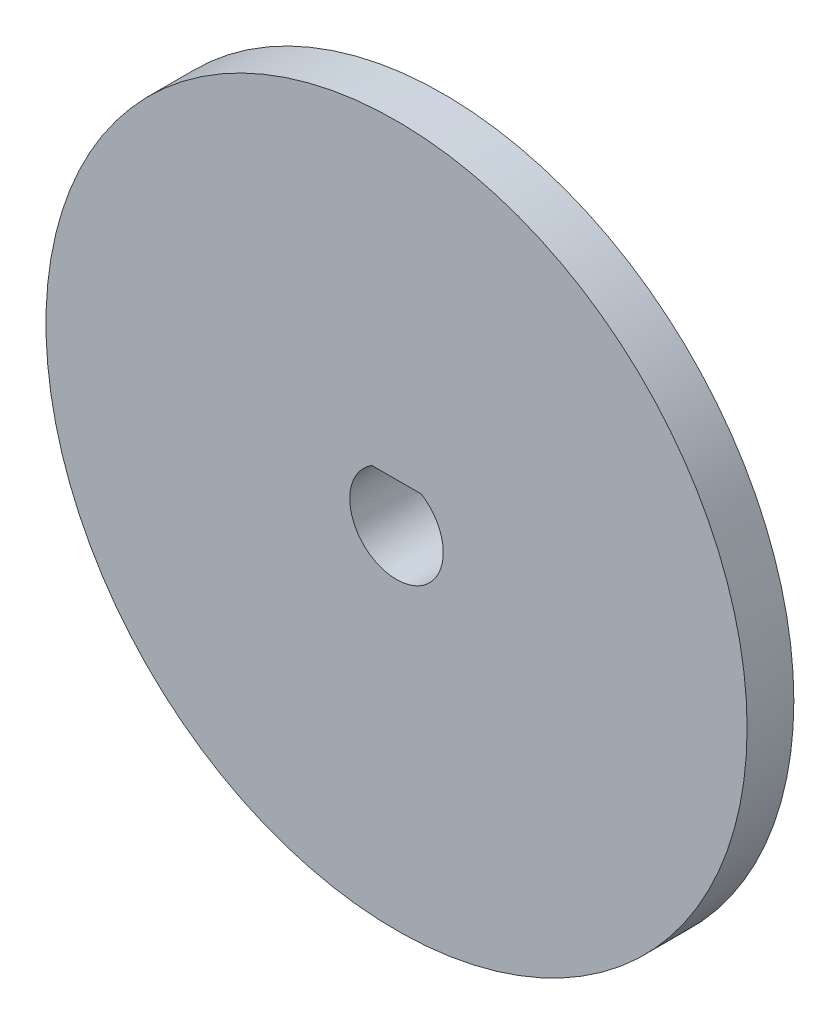
ISO-10303-21;
HEADER;
FILE_DESCRIPTION(('STEP AP214'),'2;1');
FILE_NAME('part.step','',(''),(''),'','','');
FILE_SCHEMA(('AUTOMOTIVE_DESIGN { 1 0 10303 214 1 1 1 1 }'));
ENDSEC;
DATA;
#1=APPLICATION_CONTEXT('core data for automotive mechanical design processes');
#2=APPLICATION_PROTOCOL_DEFINITION('international standard','automotive_design',2000,#1);
#3=PRODUCT_CONTEXT('',#1,'mechanical');
#4=PRODUCT('Part','Part','',(#3));
#5=PRODUCT_RELATED_PRODUCT_CATEGORY('part','',(#4));
#6=PRODUCT_DEFINITION_FORMATION('','',#4);
#7=PRODUCT_DEFINITION_CONTEXT('part definition',#1,'design');
#8=PRODUCT_DEFINITION('design','',#6,#7);
#9=PRODUCT_DEFINITION_SHAPE('','',#8);
#10=(LENGTH_UNIT() NAMED_UNIT(*) SI_UNIT(.MILLI.,.METRE.));
#11=(NAMED_UNIT(*) PLANE_ANGLE_UNIT() SI_UNIT($,.RADIAN.));
#12=(NAMED_UNIT(*) SI_UNIT($,.STERADIAN.) SOLID_ANGLE_UNIT());
#13=UNCERTAINTY_MEASURE_WITH_UNIT(LENGTH_MEASURE(1.E-05),#10,'distance_accuracy_value','');
#14=(GEOMETRIC_REPRESENTATION_CONTEXT(3) GLOBAL_UNCERTAINTY_ASSIGNED_CONTEXT((#13)) GLOBAL_UNIT_ASSIGNED_CONTEXT((#10,
#11,#12)) REPRESENTATION_CONTEXT('',''));
#15=CARTESIAN_POINT('',(0.,0.,0.));
#16=DIRECTION('',(0.,0.,1.));
#17=DIRECTION('',(1.,0.,0.));
#18=AXIS2_PLACEMENT_3D('',#15,#16,#17);
#19=CARTESIAN_POINT('',(0.,0.,-3.));
#20=DIRECTION('',(0.,0.,1.));
#21=DIRECTION('',(-1.,0.,0.));
#22=AXIS2_PLACEMENT_3D('',#19,#20,#21);
#23=CYLINDRICAL_SURFACE('',#22,3.);
#24=CARTESIAN_POINT('',(0.,0.,0.));
#25=DIRECTION('',(0.,0.,1.));
#26=DIRECTION('',(1.,0.,0.));
#27=AXIS2_PLACEMENT_3D('',#24,#25,#26);
#28=CIRCLE('',#27,3.);
#29=CARTESIAN_POINT('',(-1.58034806292791,2.55,0.));
#30=VERTEX_POINT('',#29);
#31=CARTESIAN_POINT('',(1.58034806292791,2.55,0.));
#32=VERTEX_POINT('',#31);
#33=EDGE_CURVE('E82',#30,#32,#28,.T.);
#34=ORIENTED_EDGE('',*,*,#33,.T.);
#35=DIRECTION('',(0.,0.,1.));
#36=VECTOR('',#35,1.);
#37=CARTESIAN_POINT('',(1.58034806292791,2.55,-3.));
#38=LINE('',#37,#36);
#39=CARTESIAN_POINT('',(1.58034806292791,2.55,-10.));
#40=VERTEX_POINT('',#39);
#41=EDGE_CURVE('E46',#40,#32,#38,.T.);
#42=ORIENTED_EDGE('',*,*,#41,.F.);
#43=CARTESIAN_POINT('',(0.,0.,-10.));
#44=DIRECTION('',(0.,0.,1.));
#45=DIRECTION('',(1.,0.,0.));
#46=AXIS2_PLACEMENT_3D('',#43,#44,#45);
#47=CIRCLE('',#46,3.);
#48=CARTESIAN_POINT('',(-1.58034806292791,2.55,-10.));
#49=VERTEX_POINT('',#48);
#50=EDGE_CURVE('E68',#49,#40,#47,.T.);
#51=ORIENTED_EDGE('',*,*,#50,.F.);
#52=DIRECTION('',(0.,0.,1.));
#53=VECTOR('',#52,1.);
#54=CARTESIAN_POINT('',(-1.58034806292791,2.55,-3.));
#55=LINE('',#54,#53);
#56=EDGE_CURVE('E11',#49,#30,#55,.T.);
#57=ORIENTED_EDGE('',*,*,#56,.T.);
#58=EDGE_LOOP('',(#34,#42,#51,#57));
#59=FACE_BOUND('',#58,.T.);
#60=ADVANCED_FACE('F39',(#59),#23,.F.);
#61=CARTESIAN_POINT('',(0.,2.55,-3.));
#62=DIRECTION('',(0.,1.,0.));
#63=DIRECTION('',(0.,0.,-1.));
#64=AXIS2_PLACEMENT_3D('',#61,#62,#63);
#65=PLANE('',#64);
#66=DIRECTION('',(1.,0.,0.));
#67=VECTOR('',#66,1.);
#68=CARTESIAN_POINT('',(0.,2.55,0.));
#69=LINE('',#68,#67);
#70=EDGE_CURVE('E52',#30,#32,#69,.T.);
#71=ORIENTED_EDGE('',*,*,#70,.F.);
#72=ORIENTED_EDGE('',*,*,#56,.F.);
#73=DIRECTION('',(1.,0.,0.));
#74=VECTOR('',#73,1.);
#75=CARTESIAN_POINT('',(0.,2.55,-10.));
#76=LINE('',#75,#74);
#77=EDGE_CURVE('E64',#49,#40,#76,.T.);
#78=ORIENTED_EDGE('',*,*,#77,.T.);
#79=ORIENTED_EDGE('',*,*,#41,.T.);
#80=EDGE_LOOP('',(#71,#72,#78,#79));
#81=FACE_BOUND('',#80,.T.);
#82=ADVANCED_FACE('F72',(#81),#65,.F.);
#83=CARTESIAN_POINT('',(0.,0.,-3.));
#84=DIRECTION('',(0.,0.,1.));
#85=DIRECTION('',(-1.,0.,0.));
#86=AXIS2_PLACEMENT_3D('',#83,#84,#85);
#87=CYLINDRICAL_SURFACE('',#86,22.5);
#88=CARTESIAN_POINT('',(0.,0.,-3.));
#89=DIRECTION('',(0.,0.,1.));
#90=DIRECTION('',(1.,0.,0.));
#91=AXIS2_PLACEMENT_3D('',#88,#89,#90);
#92=CIRCLE('',#91,22.5);
#93=CARTESIAN_POINT('',(22.5,0.,-3.));
#94=VERTEX_POINT('',#93);
#95=EDGE_CURVE('E83',#94,#94,#92,.T.);
#96=ORIENTED_EDGE('',*,*,#95,.T.);
#97=EDGE_LOOP('',(#96));
#98=FACE_BOUND('',#97,.T.);
#99=CARTESIAN_POINT('',(0.,0.,0.));
#100=DIRECTION('',(0.,0.,1.));
#101=DIRECTION('',(1.,0.,0.));
#102=AXIS2_PLACEMENT_3D('',#99,#100,#101);
#103=CIRCLE('',#102,22.5);
#104=CARTESIAN_POINT('',(22.5,0.,0.));
#105=VERTEX_POINT('',#104);
#106=EDGE_CURVE('E86',#105,#105,#103,.T.);
#107=ORIENTED_EDGE('',*,*,#106,.F.);
#108=EDGE_LOOP('',(#107));
#109=FACE_BOUND('',#108,.T.);
#110=ADVANCED_FACE('F102',(#98,#109),#87,.T.);
#111=CARTESIAN_POINT('',(0.,0.,-3.));
#112=DIRECTION('',(0.,0.,-1.));
#113=DIRECTION('',(1.,0.,0.));
#114=AXIS2_PLACEMENT_3D('',#111,#112,#113);
#115=PLANE('',#114);
#116=CARTESIAN_POINT('',(0.,0.,-3.));
#117=DIRECTION('',(0.,0.,1.));
#118=DIRECTION('',(1.,0.,0.));
#119=AXIS2_PLACEMENT_3D('',#116,#117,#118);
#120=CIRCLE('',#119,10.);
#121=CARTESIAN_POINT('',(10.,0.,-3.));
#122=VERTEX_POINT('',#121);
#123=EDGE_CURVE('E79',#122,#122,#120,.F.);
#124=ORIENTED_EDGE('',*,*,#123,.F.);
#125=EDGE_LOOP('',(#124));
#126=FACE_BOUND('',#125,.T.);
#127=ORIENTED_EDGE('',*,*,#95,.F.);
#128=EDGE_LOOP('',(#127));
#129=FACE_BOUND('',#128,.T.);
#130=ADVANCED_FACE('F93',(#126,#129),#115,.T.);
#131=CARTESIAN_POINT('',(0.,0.,0.));
#132=DIRECTION('',(0.,0.,-1.));
#133=DIRECTION('',(1.,0.,0.));
#134=AXIS2_PLACEMENT_3D('',#131,#132,#133);
#135=PLANE('',#134);
#136=ORIENTED_EDGE('',*,*,#106,.T.);
#137=EDGE_LOOP('',(#136));
#138=FACE_BOUND('',#137,.T.);
#139=ORIENTED_EDGE('',*,*,#33,.F.);
#140=ORIENTED_EDGE('',*,*,#70,.T.);
#141=EDGE_LOOP('',(#139,#140));
#142=FACE_BOUND('',#141,.T.);
#143=ADVANCED_FACE('F90',(#138,#142),#135,.F.);
#144=CARTESIAN_POINT('',(0.,0.,-10.));
#145=DIRECTION('',(0.,0.,1.));
#146=DIRECTION('',(-1.,0.,0.));
#147=AXIS2_PLACEMENT_3D('',#144,#145,#146);
#148=CYLINDRICAL_SURFACE('',#147,10.);
#149=ORIENTED_EDGE('',*,*,#123,.T.);
#150=EDGE_LOOP('',(#149));
#151=FACE_BOUND('',#150,.T.);
#152=CARTESIAN_POINT('',(0.,0.,-10.));
#153=DIRECTION('',(0.,0.,1.));
#154=DIRECTION('',(1.,0.,0.));
#155=AXIS2_PLACEMENT_3D('',#152,#153,#154);
#156=CIRCLE('',#155,10.);
#157=CARTESIAN_POINT('',(10.,0.,-10.));
#158=VERTEX_POINT('',#157);
#159=EDGE_CURVE('E70',#158,#158,#156,.T.);
#160=ORIENTED_EDGE('',*,*,#159,.T.);
#161=EDGE_LOOP('',(#160));
#162=FACE_BOUND('',#161,.T.);
#163=ADVANCED_FACE('F92',(#151,#162),#148,.T.);
#164=CARTESIAN_POINT('',(0.,0.,-10.));
#165=DIRECTION('',(0.,0.,-1.));
#166=DIRECTION('',(1.,0.,0.));
#167=AXIS2_PLACEMENT_3D('',#164,#165,#166);
#168=PLANE('',#167);
#169=ORIENTED_EDGE('',*,*,#50,.T.);
#170=ORIENTED_EDGE('',*,*,#77,.F.);
#171=EDGE_LOOP('',(#169,#170));
#172=FACE_BOUND('',#171,.T.);
#173=ORIENTED_EDGE('',*,*,#159,.F.);
#174=EDGE_LOOP('',(#173));
#175=FACE_BOUND('',#174,.T.);
#176=ADVANCED_FACE('F65',(#172,#175),#168,.T.);
#177=CLOSED_SHELL('',(#60,#82,#110,#130,#143,#163,#176));
#178=MANIFOLD_SOLID_BREP('B2',#177);
#179=ADVANCED_BREP_SHAPE_REPRESENTATION('',(#18,#178),#14);
#180=SHAPE_DEFINITION_REPRESENTATION(#9,#179);
ENDSEC;
END-ISO-10303-21;
